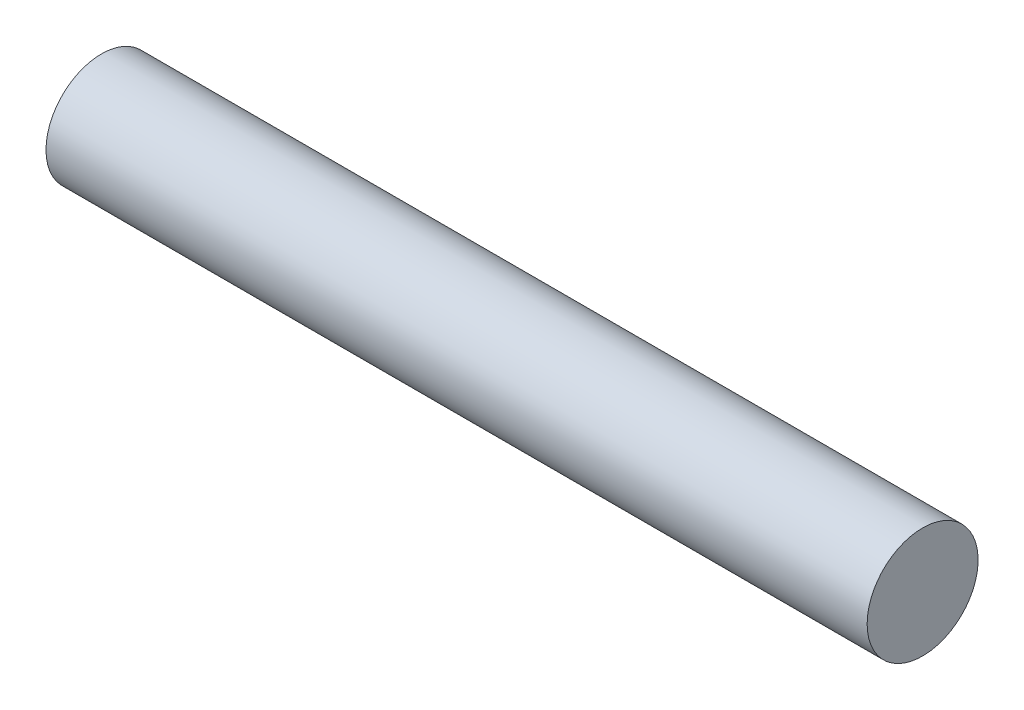
ISO-10303-21;
HEADER;
FILE_DESCRIPTION(('STEP AP214'),'2;1');
FILE_NAME('part.step','',(''),(''),'','','');
FILE_SCHEMA(('AUTOMOTIVE_DESIGN { 1 0 10303 214 1 1 1 1 }'));
ENDSEC;
DATA;
#1=APPLICATION_CONTEXT('core data for automotive mechanical design processes');
#2=APPLICATION_PROTOCOL_DEFINITION('international standard','automotive_design',2000,#1);
#3=PRODUCT_CONTEXT('',#1,'mechanical');
#4=PRODUCT('Part','Part','',(#3));
#5=PRODUCT_RELATED_PRODUCT_CATEGORY('part','',(#4));
#6=PRODUCT_DEFINITION_FORMATION('','',#4);
#7=PRODUCT_DEFINITION_CONTEXT('part definition',#1,'design');
#8=PRODUCT_DEFINITION('design','',#6,#7);
#9=PRODUCT_DEFINITION_SHAPE('','',#8);
#10=(LENGTH_UNIT() NAMED_UNIT(*) SI_UNIT(.MILLI.,.METRE.));
#11=(NAMED_UNIT(*) PLANE_ANGLE_UNIT() SI_UNIT($,.RADIAN.));
#12=(NAMED_UNIT(*) SI_UNIT($,.STERADIAN.) SOLID_ANGLE_UNIT());
#13=UNCERTAINTY_MEASURE_WITH_UNIT(LENGTH_MEASURE(1.E-05),#10,'distance_accuracy_value','');
#14=(GEOMETRIC_REPRESENTATION_CONTEXT(3) GLOBAL_UNCERTAINTY_ASSIGNED_CONTEXT((#13)) GLOBAL_UNIT_ASSIGNED_CONTEXT((#10,
#11,#12)) REPRESENTATION_CONTEXT('',''));
#15=CARTESIAN_POINT('',(0.,0.,0.));
#16=DIRECTION('',(0.,0.,1.));
#17=DIRECTION('',(1.,0.,0.));
#18=AXIS2_PLACEMENT_3D('',#15,#16,#17);
#19=CARTESIAN_POINT('',(-140.,2.5,0.));
#20=DIRECTION('',(1.,0.,0.));
#21=DIRECTION('',(0.,0.,-1.));
#22=AXIS2_PLACEMENT_3D('',#19,#20,#21);
#23=PLANE('',#22);
#24=CARTESIAN_POINT('',(-140.,0.,0.));
#25=DIRECTION('',(-1.,0.,0.));
#26=DIRECTION('',(0.,0.,1.));
#27=AXIS2_PLACEMENT_3D('',#24,#25,#26);
#28=CIRCLE('',#27,2.5);
#29=CARTESIAN_POINT('',(-140.,0.,2.5));
#30=VERTEX_POINT('',#29);
#31=EDGE_CURVE('E37',#30,#30,#28,.T.);
#32=ORIENTED_EDGE('',*,*,#31,.T.);
#33=EDGE_LOOP('',(#32));
#34=FACE_BOUND('',#33,.T.);
#35=ADVANCED_FACE('F31',(#34),#23,.F.);
#36=CARTESIAN_POINT('',(-103.,0.,0.));
#37=DIRECTION('',(-1.,0.,0.));
#38=DIRECTION('',(0.,0.,1.));
#39=AXIS2_PLACEMENT_3D('',#36,#37,#38);
#40=PLANE('',#39);
#41=CARTESIAN_POINT('',(-103.,0.,0.));
#42=DIRECTION('',(-1.,0.,0.));
#43=DIRECTION('',(0.,0.,1.));
#44=AXIS2_PLACEMENT_3D('',#41,#42,#43);
#45=CIRCLE('',#44,2.5);
#46=CARTESIAN_POINT('',(-103.,0.,2.5));
#47=VERTEX_POINT('',#46);
#48=EDGE_CURVE('E10',#47,#47,#45,.T.);
#49=ORIENTED_EDGE('',*,*,#48,.F.);
#50=EDGE_LOOP('',(#49));
#51=FACE_BOUND('',#50,.T.);
#52=ADVANCED_FACE('F46',(#51),#40,.F.);
#53=CARTESIAN_POINT('',(-110.,0.,0.));
#54=DIRECTION('',(-1.,0.,0.));
#55=DIRECTION('',(0.,0.,1.));
#56=AXIS2_PLACEMENT_3D('',#53,#54,#55);
#57=CYLINDRICAL_SURFACE('',#56,2.5);
#58=ORIENTED_EDGE('',*,*,#31,.F.);
#59=EDGE_LOOP('',(#58));
#60=FACE_BOUND('',#59,.T.);
#61=ORIENTED_EDGE('',*,*,#48,.T.);
#62=EDGE_LOOP('',(#61));
#63=FACE_BOUND('',#62,.T.);
#64=ADVANCED_FACE('F44',(#60,#63),#57,.T.);
#65=CLOSED_SHELL('',(#35,#52,#64));
#66=MANIFOLD_SOLID_BREP('B2',#65);
#67=ADVANCED_BREP_SHAPE_REPRESENTATION('',(#18,#66),#14);
#68=SHAPE_DEFINITION_REPRESENTATION(#9,#67);
ENDSEC;
END-ISO-10303-21;
